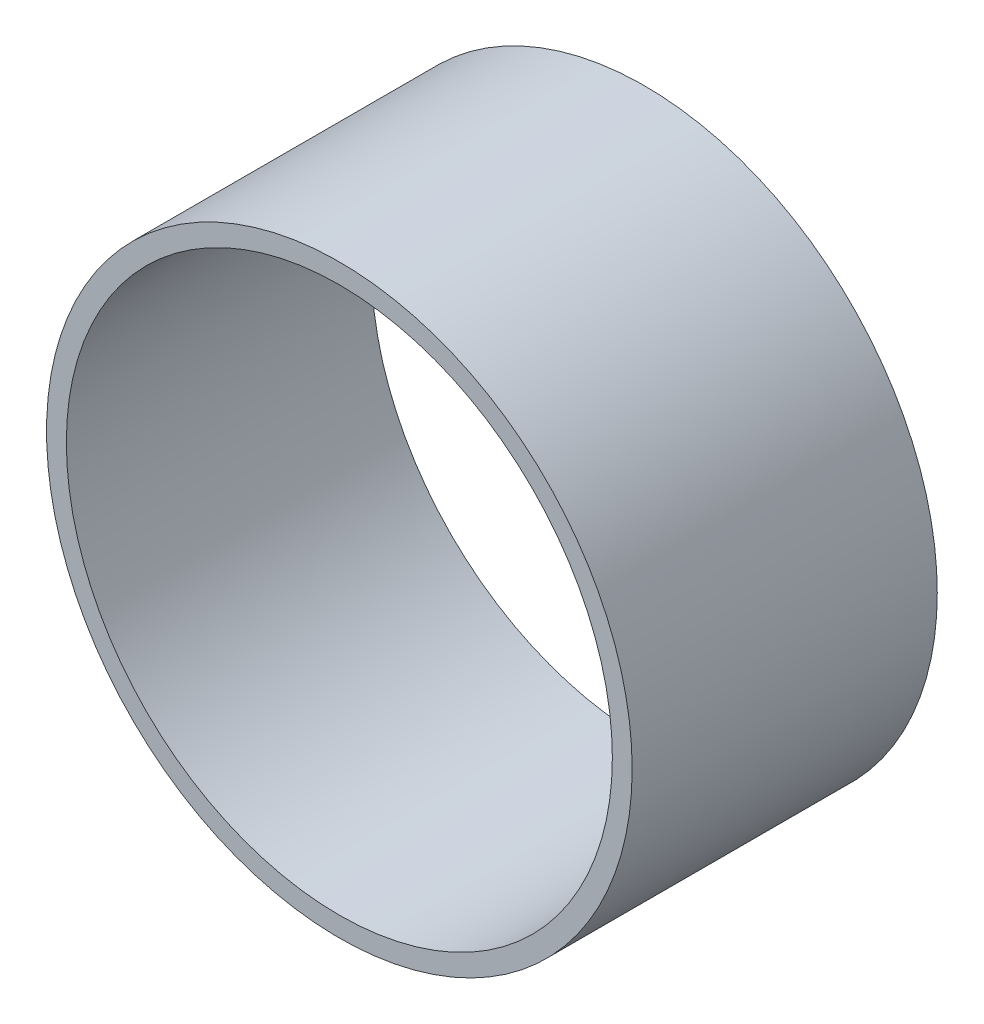
ISO-10303-21;
HEADER;
FILE_DESCRIPTION(('STEP AP214'),'2;1');
FILE_NAME('part.step','',(''),(''),'','','');
FILE_SCHEMA(('AUTOMOTIVE_DESIGN { 1 0 10303 214 1 1 1 1 }'));
ENDSEC;
DATA;
#1=APPLICATION_CONTEXT('core data for automotive mechanical design processes');
#2=APPLICATION_PROTOCOL_DEFINITION('international standard','automotive_design',2000,#1);
#3=PRODUCT_CONTEXT('',#1,'mechanical');
#4=PRODUCT('Part','Part','',(#3));
#5=PRODUCT_RELATED_PRODUCT_CATEGORY('part','',(#4));
#6=PRODUCT_DEFINITION_FORMATION('','',#4);
#7=PRODUCT_DEFINITION_CONTEXT('part definition',#1,'design');
#8=PRODUCT_DEFINITION('design','',#6,#7);
#9=PRODUCT_DEFINITION_SHAPE('','',#8);
#10=(LENGTH_UNIT() NAMED_UNIT(*) SI_UNIT(.MILLI.,.METRE.));
#11=(NAMED_UNIT(*) PLANE_ANGLE_UNIT() SI_UNIT($,.RADIAN.));
#12=(NAMED_UNIT(*) SI_UNIT($,.STERADIAN.) SOLID_ANGLE_UNIT());
#13=UNCERTAINTY_MEASURE_WITH_UNIT(LENGTH_MEASURE(1.E-05),#10,'distance_accuracy_value','');
#14=(GEOMETRIC_REPRESENTATION_CONTEXT(3) GLOBAL_UNCERTAINTY_ASSIGNED_CONTEXT((#13)) GLOBAL_UNIT_ASSIGNED_CONTEXT((#10,
#11,#12)) REPRESENTATION_CONTEXT('',''));
#15=CARTESIAN_POINT('',(0.,0.,0.));
#16=DIRECTION('',(0.,0.,1.));
#17=DIRECTION('',(1.,0.,0.));
#18=AXIS2_PLACEMENT_3D('',#15,#16,#17);
#19=CARTESIAN_POINT('',(0.,0.,0.));
#20=DIRECTION('',(0.,0.,-1.));
#21=DIRECTION('',(1.,0.,0.));
#22=AXIS2_PLACEMENT_3D('',#19,#20,#21);
#23=CYLINDRICAL_SURFACE('',#22,0.3753993);
#24=CARTESIAN_POINT('',(0.,0.,0.39116));
#25=DIRECTION('',(0.,0.,1.));
#26=DIRECTION('',(1.,0.,0.));
#27=AXIS2_PLACEMENT_3D('',#24,#25,#26);
#28=CIRCLE('',#27,0.3753993);
#29=CARTESIAN_POINT('',(0.3753993,0.,0.39116));
#30=VERTEX_POINT('',#29);
#31=EDGE_CURVE('E11',#30,#30,#28,.T.);
#32=ORIENTED_EDGE('',*,*,#31,.F.);
#33=DIRECTION('',(0.,0.,1.));
#34=VECTOR('',#33,1.);
#35=CARTESIAN_POINT('',(0.3753993,0.,0.));
#36=LINE('',#35,#34);
#37=CARTESIAN_POINT('',(0.3753993,0.,0.));
#38=VERTEX_POINT('',#37);
#39=EDGE_CURVE('E24',#38,#30,#36,.T.);
#40=ORIENTED_EDGE('',*,*,#39,.F.);
#41=CARTESIAN_POINT('',(0.,0.,0.));
#42=DIRECTION('',(0.,0.,1.));
#43=DIRECTION('',(1.,0.,0.));
#44=AXIS2_PLACEMENT_3D('',#41,#42,#43);
#45=CIRCLE('',#44,0.3753993);
#46=EDGE_CURVE('E46',#38,#38,#45,.T.);
#47=ORIENTED_EDGE('',*,*,#46,.T.);
#48=ORIENTED_EDGE('',*,*,#39,.T.);
#49=EDGE_LOOP('',(#32,#40,#47,#48));
#50=FACE_BOUND('',#49,.T.);
#51=ADVANCED_FACE('F17',(#50),#23,.T.);
#52=CARTESIAN_POINT('',(0.,0.,0.));
#53=DIRECTION('',(0.,0.,-1.));
#54=DIRECTION('',(1.,0.,0.));
#55=AXIS2_PLACEMENT_3D('',#52,#53,#54);
#56=CYLINDRICAL_SURFACE('',#55,0.3499993);
#57=DIRECTION('',(0.,0.,1.));
#58=VECTOR('',#57,1.);
#59=CARTESIAN_POINT('',(0.3499993,0.,0.));
#60=LINE('',#59,#58);
#61=CARTESIAN_POINT('',(0.3499993,0.,0.));
#62=VERTEX_POINT('',#61);
#63=CARTESIAN_POINT('',(0.3499993,0.,0.39116));
#64=VERTEX_POINT('',#63);
#65=EDGE_CURVE('E40',#62,#64,#60,.T.);
#66=ORIENTED_EDGE('',*,*,#65,.T.);
#67=CARTESIAN_POINT('',(0.,0.,0.39116));
#68=DIRECTION('',(0.,0.,1.));
#69=DIRECTION('',(1.,0.,0.));
#70=AXIS2_PLACEMENT_3D('',#67,#68,#69);
#71=CIRCLE('',#70,0.3499993);
#72=EDGE_CURVE('E45',#64,#64,#71,.T.);
#73=ORIENTED_EDGE('',*,*,#72,.T.);
#74=ORIENTED_EDGE('',*,*,#65,.F.);
#75=CARTESIAN_POINT('',(0.,0.,0.));
#76=DIRECTION('',(0.,0.,1.));
#77=DIRECTION('',(1.,0.,0.));
#78=AXIS2_PLACEMENT_3D('',#75,#76,#77);
#79=CIRCLE('',#78,0.3499993);
#80=EDGE_CURVE('E43',#62,#62,#79,.T.);
#81=ORIENTED_EDGE('',*,*,#80,.F.);
#82=EDGE_LOOP('',(#66,#73,#74,#81));
#83=FACE_BOUND('',#82,.T.);
#84=ADVANCED_FACE('F42',(#83),#56,.F.);
#85=CARTESIAN_POINT('',(0.3753993,0.,0.));
#86=DIRECTION('',(0.,0.,-1.));
#87=DIRECTION('',(-1.,0.,0.));
#88=AXIS2_PLACEMENT_3D('',#85,#86,#87);
#89=PLANE('',#88);
#90=ORIENTED_EDGE('',*,*,#46,.F.);
#91=EDGE_LOOP('',(#90));
#92=FACE_BOUND('',#91,.T.);
#93=ORIENTED_EDGE('',*,*,#80,.T.);
#94=EDGE_LOOP('',(#93));
#95=FACE_BOUND('',#94,.T.);
#96=ADVANCED_FACE('F49',(#92,#95),#89,.T.);
#97=CARTESIAN_POINT('',(0.3753993,0.,0.39116));
#98=DIRECTION('',(0.,0.,-1.));
#99=DIRECTION('',(-1.,0.,0.));
#100=AXIS2_PLACEMENT_3D('',#97,#98,#99);
#101=PLANE('',#100);
#102=ORIENTED_EDGE('',*,*,#31,.T.);
#103=EDGE_LOOP('',(#102));
#104=FACE_BOUND('',#103,.T.);
#105=ORIENTED_EDGE('',*,*,#72,.F.);
#106=EDGE_LOOP('',(#105));
#107=FACE_BOUND('',#106,.T.);
#108=ADVANCED_FACE('F56',(#104,#107),#101,.F.);
#109=CLOSED_SHELL('',(#51,#84,#96,#108));
#110=MANIFOLD_SOLID_BREP('B1',#109);
#111=ADVANCED_BREP_SHAPE_REPRESENTATION('',(#18,#110),#14);
#112=SHAPE_DEFINITION_REPRESENTATION(#9,#111);
ENDSEC;
END-ISO-10303-21;
